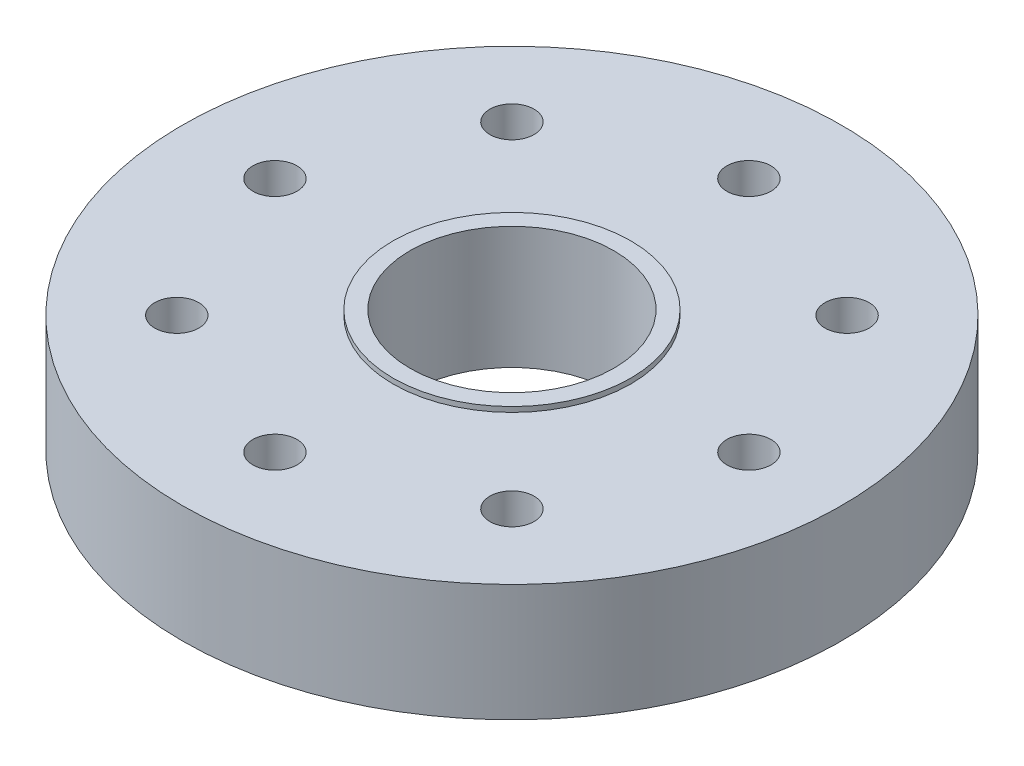
ISO-10303-21;
HEADER;
FILE_DESCRIPTION(('STEP AP214'),'2;1');
FILE_NAME('part.step','',(''),(''),'','','');
FILE_SCHEMA(('AUTOMOTIVE_DESIGN { 1 0 10303 214 1 1 1 1 }'));
ENDSEC;
DATA;
#1=APPLICATION_CONTEXT('core data for automotive mechanical design processes');
#2=APPLICATION_PROTOCOL_DEFINITION('international standard','automotive_design',2000,#1);
#3=PRODUCT_CONTEXT('',#1,'mechanical');
#4=PRODUCT('Part','Part','',(#3));
#5=PRODUCT_RELATED_PRODUCT_CATEGORY('part','',(#4));
#6=PRODUCT_DEFINITION_FORMATION('','',#4);
#7=PRODUCT_DEFINITION_CONTEXT('part definition',#1,'design');
#8=PRODUCT_DEFINITION('design','',#6,#7);
#9=PRODUCT_DEFINITION_SHAPE('','',#8);
#10=(LENGTH_UNIT() NAMED_UNIT(*) SI_UNIT(.MILLI.,.METRE.));
#11=(NAMED_UNIT(*) PLANE_ANGLE_UNIT() SI_UNIT($,.RADIAN.));
#12=(NAMED_UNIT(*) SI_UNIT($,.STERADIAN.) SOLID_ANGLE_UNIT());
#13=UNCERTAINTY_MEASURE_WITH_UNIT(LENGTH_MEASURE(1.E-05),#10,'distance_accuracy_value','');
#14=(GEOMETRIC_REPRESENTATION_CONTEXT(3) GLOBAL_UNCERTAINTY_ASSIGNED_CONTEXT((#13)) GLOBAL_UNIT_ASSIGNED_CONTEXT((#10,
#11,#12)) REPRESENTATION_CONTEXT('',''));
#15=CARTESIAN_POINT('',(0.,0.,0.));
#16=DIRECTION('',(0.,0.,1.));
#17=DIRECTION('',(1.,0.,0.));
#18=AXIS2_PLACEMENT_3D('',#15,#16,#17);
#19=CARTESIAN_POINT('',(0.,3.6,0.));
#20=DIRECTION('',(0.,-1.,0.));
#21=DIRECTION('',(0.,0.,-1.));
#22=AXIS2_PLACEMENT_3D('',#19,#20,#21);
#23=CYLINDRICAL_SURFACE('',#22,9.7);
#24=CARTESIAN_POINT('',(0.,0.,0.));
#25=DIRECTION('',(0.,1.,0.));
#26=DIRECTION('',(0.,0.,1.));
#27=AXIS2_PLACEMENT_3D('',#24,#25,#26);
#28=CIRCLE('',#27,9.7);
#29=CARTESIAN_POINT('',(0.,0.,9.7));
#30=VERTEX_POINT('',#29);
#31=EDGE_CURVE('E10',#30,#30,#28,.T.);
#32=ORIENTED_EDGE('',*,*,#31,.T.);
#33=EDGE_LOOP('',(#32));
#34=FACE_BOUND('',#33,.T.);
#35=CARTESIAN_POINT('',(0.,3.45,0.));
#36=DIRECTION('',(0.,1.,0.));
#37=DIRECTION('',(0.,0.,1.));
#38=AXIS2_PLACEMENT_3D('',#35,#36,#37);
#39=CIRCLE('',#38,9.7);
#40=CARTESIAN_POINT('',(0.,3.45,9.7));
#41=VERTEX_POINT('',#40);
#42=EDGE_CURVE('E115',#41,#41,#39,.T.);
#43=ORIENTED_EDGE('',*,*,#42,.F.);
#44=EDGE_LOOP('',(#43));
#45=FACE_BOUND('',#44,.T.);
#46=ADVANCED_FACE('F37',(#34,#45),#23,.T.);
#47=CARTESIAN_POINT('',(0.,3.6,0.));
#48=DIRECTION('',(0.,1.,0.));
#49=DIRECTION('',(0.,0.,1.));
#50=AXIS2_PLACEMENT_3D('',#47,#48,#49);
#51=PLANE('',#50);
#52=CARTESIAN_POINT('',(0.,3.6,0.));
#53=DIRECTION('',(0.,1.,0.));
#54=DIRECTION('',(0.,0.,1.));
#55=AXIS2_PLACEMENT_3D('',#52,#53,#54);
#56=CIRCLE('',#55,3.);
#57=CARTESIAN_POINT('',(0.,3.6,3.));
#58=VERTEX_POINT('',#57);
#59=EDGE_CURVE('E58',#58,#58,#56,.T.);
#60=ORIENTED_EDGE('',*,*,#59,.F.);
#61=EDGE_LOOP('',(#60));
#62=FACE_BOUND('',#61,.T.);
#63=CARTESIAN_POINT('',(0.,3.6,0.));
#64=DIRECTION('',(0.,1.,0.));
#65=DIRECTION('',(0.,0.,1.));
#66=AXIS2_PLACEMENT_3D('',#63,#64,#65);
#67=CIRCLE('',#66,3.5);
#68=CARTESIAN_POINT('',(0.,3.6,3.5));
#69=VERTEX_POINT('',#68);
#70=EDGE_CURVE('E99',#69,#69,#67,.T.);
#71=ORIENTED_EDGE('',*,*,#70,.T.);
#72=EDGE_LOOP('',(#71));
#73=FACE_BOUND('',#72,.T.);
#74=ADVANCED_FACE('F182',(#62,#73),#51,.T.);
#75=CARTESIAN_POINT('',(-4.93206979877623,0.,4.93206979877611));
#76=DIRECTION('',(0.,1.,0.));
#77=DIRECTION('',(0.,0.,1.));
#78=AXIS2_PLACEMENT_3D('',#75,#76,#77);
#79=CYLINDRICAL_SURFACE('',#78,0.649999999999998);
#80=CARTESIAN_POINT('',(-4.93206979877623,0.,4.93206979877611));
#81=DIRECTION('',(0.,1.,0.));
#82=DIRECTION('',(0.,0.,1.));
#83=AXIS2_PLACEMENT_3D('',#80,#81,#82);
#84=CIRCLE('',#83,0.649999999999998);
#85=CARTESIAN_POINT('',(-4.93206979877623,0.,5.58206979877611));
#86=VERTEX_POINT('',#85);
#87=EDGE_CURVE('E79',#86,#86,#84,.T.);
#88=ORIENTED_EDGE('',*,*,#87,.F.);
#89=EDGE_LOOP('',(#88));
#90=FACE_BOUND('',#89,.T.);
#91=CARTESIAN_POINT('',(-4.93206979877623,3.45,4.93206979877611));
#92=DIRECTION('',(0.,1.,0.));
#93=DIRECTION('',(0.,0.,1.));
#94=AXIS2_PLACEMENT_3D('',#91,#92,#93);
#95=CIRCLE('',#94,0.649999999999998);
#96=CARTESIAN_POINT('',(-4.93206979877623,3.45,5.58206979877611));
#97=VERTEX_POINT('',#96);
#98=EDGE_CURVE('E111',#97,#97,#95,.F.);
#99=ORIENTED_EDGE('',*,*,#98,.F.);
#100=EDGE_LOOP('',(#99));
#101=FACE_BOUND('',#100,.T.);
#102=ADVANCED_FACE('F186',(#90,#101),#79,.F.);
#103=CARTESIAN_POINT('',(0.,0.,6.975));
#104=DIRECTION('',(0.,1.,0.));
#105=DIRECTION('',(0.,0.,1.));
#106=AXIS2_PLACEMENT_3D('',#103,#104,#105);
#107=CYLINDRICAL_SURFACE('',#106,0.649999999999999);
#108=CARTESIAN_POINT('',(0.,0.,6.975));
#109=DIRECTION('',(0.,1.,0.));
#110=DIRECTION('',(0.,0.,1.));
#111=AXIS2_PLACEMENT_3D('',#108,#109,#110);
#112=CIRCLE('',#111,0.649999999999999);
#113=CARTESIAN_POINT('',(0.,0.,7.625));
#114=VERTEX_POINT('',#113);
#115=EDGE_CURVE('E76',#114,#114,#112,.T.);
#116=ORIENTED_EDGE('',*,*,#115,.F.);
#117=EDGE_LOOP('',(#116));
#118=FACE_BOUND('',#117,.T.);
#119=CARTESIAN_POINT('',(0.,3.45,6.975));
#120=DIRECTION('',(0.,1.,0.));
#121=DIRECTION('',(0.,0.,1.));
#122=AXIS2_PLACEMENT_3D('',#119,#120,#121);
#123=CIRCLE('',#122,0.649999999999999);
#124=CARTESIAN_POINT('',(0.,3.45,7.625));
#125=VERTEX_POINT('',#124);
#126=EDGE_CURVE('E119',#125,#125,#123,.F.);
#127=ORIENTED_EDGE('',*,*,#126,.F.);
#128=EDGE_LOOP('',(#127));
#129=FACE_BOUND('',#128,.T.);
#130=ADVANCED_FACE('F193',(#118,#129),#107,.F.);
#131=CARTESIAN_POINT('',(4.93206979877613,0.,4.93206979877621));
#132=DIRECTION('',(0.,1.,0.));
#133=DIRECTION('',(0.,0.,1.));
#134=AXIS2_PLACEMENT_3D('',#131,#132,#133);
#135=CYLINDRICAL_SURFACE('',#134,0.649999999999999);
#136=CARTESIAN_POINT('',(4.93206979877613,0.,4.93206979877621));
#137=DIRECTION('',(0.,1.,0.));
#138=DIRECTION('',(0.,0.,1.));
#139=AXIS2_PLACEMENT_3D('',#136,#137,#138);
#140=CIRCLE('',#139,0.649999999999999);
#141=CARTESIAN_POINT('',(4.93206979877613,0.,5.58206979877621));
#142=VERTEX_POINT('',#141);
#143=EDGE_CURVE('E72',#142,#142,#140,.T.);
#144=ORIENTED_EDGE('',*,*,#143,.F.);
#145=EDGE_LOOP('',(#144));
#146=FACE_BOUND('',#145,.T.);
#147=CARTESIAN_POINT('',(4.93206979877613,3.45,4.93206979877621));
#148=DIRECTION('',(0.,1.,0.));
#149=DIRECTION('',(0.,0.,1.));
#150=AXIS2_PLACEMENT_3D('',#147,#148,#149);
#151=CIRCLE('',#150,0.649999999999999);
#152=CARTESIAN_POINT('',(4.93206979877613,3.45,5.58206979877621));
#153=VERTEX_POINT('',#152);
#154=EDGE_CURVE('E107',#153,#153,#151,.F.);
#155=ORIENTED_EDGE('',*,*,#154,.F.);
#156=EDGE_LOOP('',(#155));
#157=FACE_BOUND('',#156,.T.);
#158=ADVANCED_FACE('F219',(#146,#157),#135,.F.);
#159=CARTESIAN_POINT('',(6.975,0.,0.));
#160=DIRECTION('',(0.,1.,0.));
#161=DIRECTION('',(0.,0.,1.));
#162=AXIS2_PLACEMENT_3D('',#159,#160,#161);
#163=CYLINDRICAL_SURFACE('',#162,0.649999999999999);
#164=CARTESIAN_POINT('',(6.975,0.,0.));
#165=DIRECTION('',(0.,1.,0.));
#166=DIRECTION('',(0.,0.,1.));
#167=AXIS2_PLACEMENT_3D('',#164,#165,#166);
#168=CIRCLE('',#167,0.649999999999999);
#169=CARTESIAN_POINT('',(6.975,0.,0.650000000000048));
#170=VERTEX_POINT('',#169);
#171=EDGE_CURVE('E68',#170,#170,#168,.T.);
#172=ORIENTED_EDGE('',*,*,#171,.F.);
#173=EDGE_LOOP('',(#172));
#174=FACE_BOUND('',#173,.T.);
#175=CARTESIAN_POINT('',(6.975,3.45,0.));
#176=DIRECTION('',(0.,1.,0.));
#177=DIRECTION('',(0.,0.,1.));
#178=AXIS2_PLACEMENT_3D('',#175,#176,#177);
#179=CIRCLE('',#178,0.649999999999999);
#180=CARTESIAN_POINT('',(6.975,3.45,0.650000000000048));
#181=VERTEX_POINT('',#180);
#182=EDGE_CURVE('E123',#181,#181,#179,.F.);
#183=ORIENTED_EDGE('',*,*,#182,.F.);
#184=EDGE_LOOP('',(#183));
#185=FACE_BOUND('',#184,.T.);
#186=ADVANCED_FACE('F223',(#174,#185),#163,.F.);
#187=CARTESIAN_POINT('',(4.93206979877619,0.,-4.93206979877614));
#188=DIRECTION('',(0.,1.,0.));
#189=DIRECTION('',(0.,0.,1.));
#190=AXIS2_PLACEMENT_3D('',#187,#188,#189);
#191=CYLINDRICAL_SURFACE('',#190,0.649999999999999);
#192=CARTESIAN_POINT('',(4.93206979877619,0.,-4.93206979877614));
#193=DIRECTION('',(0.,1.,0.));
#194=DIRECTION('',(0.,0.,1.));
#195=AXIS2_PLACEMENT_3D('',#192,#193,#194);
#196=CIRCLE('',#195,0.649999999999999);
#197=CARTESIAN_POINT('',(4.93206979877619,0.,-4.28206979877614));
#198=VERTEX_POINT('',#197);
#199=EDGE_CURVE('E64',#198,#198,#196,.T.);
#200=ORIENTED_EDGE('',*,*,#199,.F.);
#201=EDGE_LOOP('',(#200));
#202=FACE_BOUND('',#201,.T.);
#203=CARTESIAN_POINT('',(4.93206979877619,3.45,-4.93206979877614));
#204=DIRECTION('',(0.,1.,0.));
#205=DIRECTION('',(0.,0.,1.));
#206=AXIS2_PLACEMENT_3D('',#203,#204,#205);
#207=CIRCLE('',#206,0.649999999999999);
#208=CARTESIAN_POINT('',(4.93206979877619,3.45,-4.28206979877614));
#209=VERTEX_POINT('',#208);
#210=EDGE_CURVE('E96',#209,#209,#207,.F.);
#211=ORIENTED_EDGE('',*,*,#210,.F.);
#212=EDGE_LOOP('',(#211));
#213=FACE_BOUND('',#212,.T.);
#214=ADVANCED_FACE('F177',(#202,#213),#191,.F.);
#215=CARTESIAN_POINT('',(0.,0.,-6.975));
#216=DIRECTION('',(0.,1.,0.));
#217=DIRECTION('',(0.,0.,1.));
#218=AXIS2_PLACEMENT_3D('',#215,#216,#217);
#219=CYLINDRICAL_SURFACE('',#218,0.649999999999999);
#220=CARTESIAN_POINT('',(0.,0.,-6.975));
#221=DIRECTION('',(0.,1.,0.));
#222=DIRECTION('',(0.,0.,1.));
#223=AXIS2_PLACEMENT_3D('',#220,#221,#222);
#224=CIRCLE('',#223,0.649999999999999);
#225=CARTESIAN_POINT('',(0.,0.,-6.325));
#226=VERTEX_POINT('',#225);
#227=EDGE_CURVE('E55',#226,#226,#224,.T.);
#228=ORIENTED_EDGE('',*,*,#227,.F.);
#229=EDGE_LOOP('',(#228));
#230=FACE_BOUND('',#229,.T.);
#231=CARTESIAN_POINT('',(0.,3.45,-6.975));
#232=DIRECTION('',(0.,1.,0.));
#233=DIRECTION('',(0.,0.,1.));
#234=AXIS2_PLACEMENT_3D('',#231,#232,#233);
#235=CIRCLE('',#234,0.649999999999999);
#236=CARTESIAN_POINT('',(0.,3.45,-6.325));
#237=VERTEX_POINT('',#236);
#238=EDGE_CURVE('E127',#237,#237,#235,.F.);
#239=ORIENTED_EDGE('',*,*,#238,.F.);
#240=EDGE_LOOP('',(#239));
#241=FACE_BOUND('',#240,.T.);
#242=ADVANCED_FACE('F167',(#230,#241),#219,.F.);
#243=CARTESIAN_POINT('',(-4.93206979877616,0.,-4.93206979877618));
#244=DIRECTION('',(0.,1.,0.));
#245=DIRECTION('',(0.,0.,1.));
#246=AXIS2_PLACEMENT_3D('',#243,#244,#245);
#247=CYLINDRICAL_SURFACE('',#246,0.649999999999999);
#248=CARTESIAN_POINT('',(-4.93206979877616,0.,-4.93206979877618));
#249=DIRECTION('',(0.,1.,0.));
#250=DIRECTION('',(0.,0.,1.));
#251=AXIS2_PLACEMENT_3D('',#248,#249,#250);
#252=CIRCLE('',#251,0.649999999999999);
#253=CARTESIAN_POINT('',(-4.93206979877616,0.,-4.28206979877618));
#254=VERTEX_POINT('',#253);
#255=EDGE_CURVE('E49',#254,#254,#252,.T.);
#256=ORIENTED_EDGE('',*,*,#255,.F.);
#257=EDGE_LOOP('',(#256));
#258=FACE_BOUND('',#257,.T.);
#259=CARTESIAN_POINT('',(-4.93206979877616,3.45,-4.93206979877618));
#260=DIRECTION('',(0.,1.,0.));
#261=DIRECTION('',(0.,0.,1.));
#262=AXIS2_PLACEMENT_3D('',#259,#260,#261);
#263=CIRCLE('',#262,0.649999999999999);
#264=CARTESIAN_POINT('',(-4.93206979877616,3.45,-4.28206979877618));
#265=VERTEX_POINT('',#264);
#266=EDGE_CURVE('E91',#265,#265,#263,.F.);
#267=ORIENTED_EDGE('',*,*,#266,.F.);
#268=EDGE_LOOP('',(#267));
#269=FACE_BOUND('',#268,.T.);
#270=ADVANCED_FACE('F164',(#258,#269),#247,.F.);
#271=CARTESIAN_POINT('',(-6.975,0.,0.));
#272=DIRECTION('',(0.,1.,0.));
#273=DIRECTION('',(0.,0.,1.));
#274=AXIS2_PLACEMENT_3D('',#271,#272,#273);
#275=CYLINDRICAL_SURFACE('',#274,0.649999999999999);
#276=CARTESIAN_POINT('',(-6.975,0.,0.));
#277=DIRECTION('',(0.,1.,0.));
#278=DIRECTION('',(0.,0.,1.));
#279=AXIS2_PLACEMENT_3D('',#276,#277,#278);
#280=CIRCLE('',#279,0.649999999999999);
#281=CARTESIAN_POINT('',(-6.975,0.,0.649999999999999));
#282=VERTEX_POINT('',#281);
#283=EDGE_CURVE('E44',#282,#282,#280,.T.);
#284=ORIENTED_EDGE('',*,*,#283,.F.);
#285=EDGE_LOOP('',(#284));
#286=FACE_BOUND('',#285,.T.);
#287=CARTESIAN_POINT('',(-6.975,3.45,0.));
#288=DIRECTION('',(0.,1.,0.));
#289=DIRECTION('',(0.,0.,1.));
#290=AXIS2_PLACEMENT_3D('',#287,#288,#289);
#291=CIRCLE('',#290,0.649999999999999);
#292=CARTESIAN_POINT('',(-6.975,3.45,0.649999999999999));
#293=VERTEX_POINT('',#292);
#294=EDGE_CURVE('E131',#293,#293,#291,.F.);
#295=ORIENTED_EDGE('',*,*,#294,.F.);
#296=EDGE_LOOP('',(#295));
#297=FACE_BOUND('',#296,.T.);
#298=ADVANCED_FACE('F166',(#286,#297),#275,.F.);
#299=CARTESIAN_POINT('',(0.,0.,0.));
#300=DIRECTION('',(0.,1.,0.));
#301=DIRECTION('',(0.,0.,1.));
#302=AXIS2_PLACEMENT_3D('',#299,#300,#301);
#303=PLANE('',#302);
#304=CARTESIAN_POINT('',(0.,0.,0.));
#305=DIRECTION('',(0.,1.,0.));
#306=DIRECTION('',(0.,0.,1.));
#307=AXIS2_PLACEMENT_3D('',#304,#305,#306);
#308=CIRCLE('',#307,3.);
#309=CARTESIAN_POINT('',(0.,0.,3.));
#310=VERTEX_POINT('',#309);
#311=EDGE_CURVE('E86',#310,#310,#308,.T.);
#312=ORIENTED_EDGE('',*,*,#311,.T.);
#313=EDGE_LOOP('',(#312));
#314=FACE_BOUND('',#313,.T.);
#315=ORIENTED_EDGE('',*,*,#283,.T.);
#316=EDGE_LOOP('',(#315));
#317=FACE_BOUND('',#316,.T.);
#318=ORIENTED_EDGE('',*,*,#255,.T.);
#319=EDGE_LOOP('',(#318));
#320=FACE_BOUND('',#319,.T.);
#321=ORIENTED_EDGE('',*,*,#227,.T.);
#322=EDGE_LOOP('',(#321));
#323=FACE_BOUND('',#322,.T.);
#324=ORIENTED_EDGE('',*,*,#199,.T.);
#325=EDGE_LOOP('',(#324));
#326=FACE_BOUND('',#325,.T.);
#327=ORIENTED_EDGE('',*,*,#171,.T.);
#328=EDGE_LOOP('',(#327));
#329=FACE_BOUND('',#328,.T.);
#330=ORIENTED_EDGE('',*,*,#143,.T.);
#331=EDGE_LOOP('',(#330));
#332=FACE_BOUND('',#331,.T.);
#333=ORIENTED_EDGE('',*,*,#115,.T.);
#334=EDGE_LOOP('',(#333));
#335=FACE_BOUND('',#334,.T.);
#336=ORIENTED_EDGE('',*,*,#87,.T.);
#337=EDGE_LOOP('',(#336));
#338=FACE_BOUND('',#337,.T.);
#339=ORIENTED_EDGE('',*,*,#31,.F.);
#340=EDGE_LOOP('',(#339));
#341=FACE_BOUND('',#340,.T.);
#342=ADVANCED_FACE('F174',(#314,#317,#320,#323,#326,#329,#332,#335,#338,#341),#303,.F.);
#343=CARTESIAN_POINT('',(0.,0.,0.));
#344=DIRECTION('',(0.,1.,0.));
#345=DIRECTION('',(0.,0.,1.));
#346=AXIS2_PLACEMENT_3D('',#343,#344,#345);
#347=CYLINDRICAL_SURFACE('',#346,3.);
#348=ORIENTED_EDGE('',*,*,#59,.T.);
#349=EDGE_LOOP('',(#348));
#350=FACE_BOUND('',#349,.T.);
#351=ORIENTED_EDGE('',*,*,#311,.F.);
#352=EDGE_LOOP('',(#351));
#353=FACE_BOUND('',#352,.T.);
#354=ADVANCED_FACE('F199',(#350,#353),#347,.F.);
#355=CARTESIAN_POINT('',(0.,3.45,0.));
#356=DIRECTION('',(0.,1.,0.));
#357=DIRECTION('',(0.,0.,1.));
#358=AXIS2_PLACEMENT_3D('',#355,#356,#357);
#359=CYLINDRICAL_SURFACE('',#358,3.5);
#360=CARTESIAN_POINT('',(0.,3.45,0.));
#361=DIRECTION('',(0.,1.,0.));
#362=DIRECTION('',(0.,0.,1.));
#363=AXIS2_PLACEMENT_3D('',#360,#361,#362);
#364=CIRCLE('',#363,3.5);
#365=CARTESIAN_POINT('',(0.,3.45,3.5));
#366=VERTEX_POINT('',#365);
#367=EDGE_CURVE('E102',#366,#366,#364,.T.);
#368=ORIENTED_EDGE('',*,*,#367,.T.);
#369=EDGE_LOOP('',(#368));
#370=FACE_BOUND('',#369,.T.);
#371=ORIENTED_EDGE('',*,*,#70,.F.);
#372=EDGE_LOOP('',(#371));
#373=FACE_BOUND('',#372,.T.);
#374=ADVANCED_FACE('F139',(#370,#373),#359,.T.);
#375=CARTESIAN_POINT('',(0.,3.45,0.));
#376=DIRECTION('',(0.,1.,0.));
#377=DIRECTION('',(0.,0.,1.));
#378=AXIS2_PLACEMENT_3D('',#375,#376,#377);
#379=PLANE('',#378);
#380=ORIENTED_EDGE('',*,*,#367,.F.);
#381=EDGE_LOOP('',(#380));
#382=FACE_BOUND('',#381,.T.);
#383=ORIENTED_EDGE('',*,*,#294,.T.);
#384=EDGE_LOOP('',(#383));
#385=FACE_BOUND('',#384,.T.);
#386=ORIENTED_EDGE('',*,*,#238,.T.);
#387=EDGE_LOOP('',(#386));
#388=FACE_BOUND('',#387,.T.);
#389=ORIENTED_EDGE('',*,*,#182,.T.);
#390=EDGE_LOOP('',(#389));
#391=FACE_BOUND('',#390,.T.);
#392=ORIENTED_EDGE('',*,*,#126,.T.);
#393=EDGE_LOOP('',(#392));
#394=FACE_BOUND('',#393,.T.);
#395=ORIENTED_EDGE('',*,*,#42,.T.);
#396=EDGE_LOOP('',(#395));
#397=FACE_BOUND('',#396,.T.);
#398=ORIENTED_EDGE('',*,*,#98,.T.);
#399=EDGE_LOOP('',(#398));
#400=FACE_BOUND('',#399,.T.);
#401=ORIENTED_EDGE('',*,*,#154,.T.);
#402=EDGE_LOOP('',(#401));
#403=FACE_BOUND('',#402,.T.);
#404=ORIENTED_EDGE('',*,*,#210,.T.);
#405=EDGE_LOOP('',(#404));
#406=FACE_BOUND('',#405,.T.);
#407=ORIENTED_EDGE('',*,*,#266,.T.);
#408=EDGE_LOOP('',(#407));
#409=FACE_BOUND('',#408,.T.);
#410=ADVANCED_FACE('F142',(#382,#385,#388,#391,#394,#397,#400,#403,#406,#409),#379,.T.);
#411=CLOSED_SHELL('',(#46,#74,#102,#130,#158,#186,#214,#242,#270,#298,#342,#354,#374,#410));
#412=MANIFOLD_SOLID_BREP('B2',#411);
#413=ADVANCED_BREP_SHAPE_REPRESENTATION('',(#18,#412),#14);
#414=SHAPE_DEFINITION_REPRESENTATION(#9,#413);
ENDSEC;
END-ISO-10303-21;
